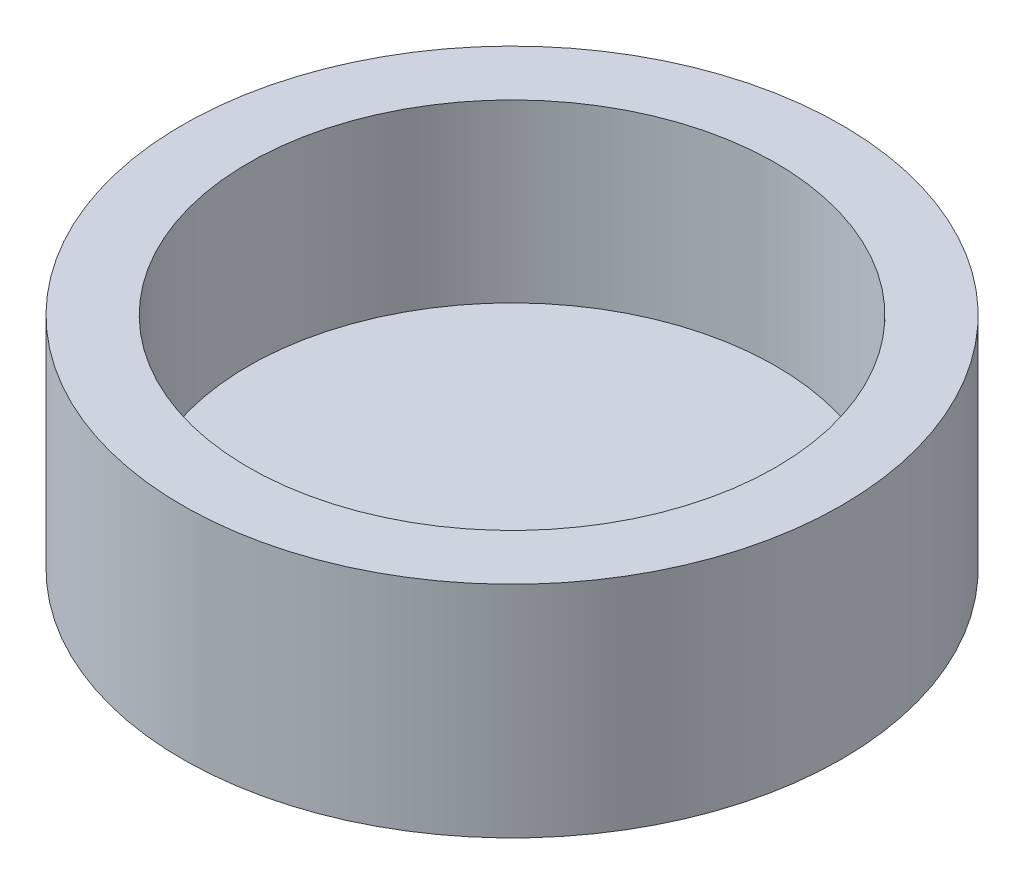
ISO-10303-21;
HEADER;
FILE_DESCRIPTION(('STEP AP214'),'2;1');
FILE_NAME('part.step','',(''),(''),'','','');
FILE_SCHEMA(('AUTOMOTIVE_DESIGN { 1 0 10303 214 1 1 1 1 }'));
ENDSEC;
DATA;
#1=APPLICATION_CONTEXT('core data for automotive mechanical design processes');
#2=APPLICATION_PROTOCOL_DEFINITION('international standard','automotive_design',2000,#1);
#3=PRODUCT_CONTEXT('',#1,'mechanical');
#4=PRODUCT('Part','Part','',(#3));
#5=PRODUCT_RELATED_PRODUCT_CATEGORY('part','',(#4));
#6=PRODUCT_DEFINITION_FORMATION('','',#4);
#7=PRODUCT_DEFINITION_CONTEXT('part definition',#1,'design');
#8=PRODUCT_DEFINITION('design','',#6,#7);
#9=PRODUCT_DEFINITION_SHAPE('','',#8);
#10=(LENGTH_UNIT() NAMED_UNIT(*) SI_UNIT(.MILLI.,.METRE.));
#11=(NAMED_UNIT(*) PLANE_ANGLE_UNIT() SI_UNIT($,.RADIAN.));
#12=(NAMED_UNIT(*) SI_UNIT($,.STERADIAN.) SOLID_ANGLE_UNIT());
#13=UNCERTAINTY_MEASURE_WITH_UNIT(LENGTH_MEASURE(1.E-05),#10,'distance_accuracy_value','');
#14=(GEOMETRIC_REPRESENTATION_CONTEXT(3) GLOBAL_UNCERTAINTY_ASSIGNED_CONTEXT((#13)) GLOBAL_UNIT_ASSIGNED_CONTEXT((#10,
#11,#12)) REPRESENTATION_CONTEXT('',''));
#15=CARTESIAN_POINT('',(0.,0.,0.));
#16=DIRECTION('',(0.,0.,1.));
#17=DIRECTION('',(1.,0.,0.));
#18=AXIS2_PLACEMENT_3D('',#15,#16,#17);
#19=CARTESIAN_POINT('',(0.,0.,0.));
#20=DIRECTION('',(0.,1.,0.));
#21=DIRECTION('',(-1.,0.,0.));
#22=AXIS2_PLACEMENT_3D('',#19,#20,#21);
#23=PLANE('',#22);
#24=CARTESIAN_POINT('',(0.,0.,0.));
#25=DIRECTION('',(0.,-1.,0.));
#26=DIRECTION('',(1.,0.,0.));
#27=AXIS2_PLACEMENT_3D('',#24,#25,#26);
#28=CIRCLE('',#27,6.);
#29=CARTESIAN_POINT('',(6.,0.,0.));
#30=VERTEX_POINT('',#29);
#31=EDGE_CURVE('E10',#30,#30,#28,.T.);
#32=ORIENTED_EDGE('',*,*,#31,.F.);
#33=EDGE_LOOP('',(#32));
#34=FACE_BOUND('',#33,.T.);
#35=ADVANCED_FACE('F42',(#34),#23,.T.);
#36=CARTESIAN_POINT('',(3.4200822914393E-13,-99.7036160509116,0.));
#37=DIRECTION('',(0.,-1.,0.));
#38=DIRECTION('',(1.,0.,0.));
#39=AXIS2_PLACEMENT_3D('',#36,#37,#38);
#40=CYLINDRICAL_SURFACE('',#39,6.00000000000001);
#41=ORIENTED_EDGE('',*,*,#31,.T.);
#42=EDGE_LOOP('',(#41));
#43=FACE_BOUND('',#42,.T.);
#44=CARTESIAN_POINT('',(0.,3.99999999999999,0.));
#45=DIRECTION('',(0.,-1.,0.));
#46=DIRECTION('',(1.,0.,0.));
#47=AXIS2_PLACEMENT_3D('',#44,#45,#46);
#48=CIRCLE('',#47,6.00000000000001);
#49=CARTESIAN_POINT('',(6.,4.00000000000001,0.));
#50=VERTEX_POINT('',#49);
#51=EDGE_CURVE('E49',#50,#50,#48,.T.);
#52=ORIENTED_EDGE('',*,*,#51,.F.);
#53=EDGE_LOOP('',(#52));
#54=FACE_BOUND('',#53,.T.);
#55=ADVANCED_FACE('F78',(#43,#54),#40,.F.);
#56=CARTESIAN_POINT('',(6.,4.,0.));
#57=DIRECTION('',(0.,1.,0.));
#58=DIRECTION('',(-1.,0.,0.));
#59=AXIS2_PLACEMENT_3D('',#56,#57,#58);
#60=PLANE('',#59);
#61=ORIENTED_EDGE('',*,*,#51,.T.);
#62=EDGE_LOOP('',(#61));
#63=FACE_BOUND('',#62,.T.);
#64=CARTESIAN_POINT('',(0.,3.99999999999998,0.));
#65=DIRECTION('',(0.,-1.,0.));
#66=DIRECTION('',(1.,0.,0.));
#67=AXIS2_PLACEMENT_3D('',#64,#65,#66);
#68=CIRCLE('',#67,7.50000000000001);
#69=CARTESIAN_POINT('',(7.5,4.,0.));
#70=VERTEX_POINT('',#69);
#71=EDGE_CURVE('E54',#70,#70,#68,.T.);
#72=ORIENTED_EDGE('',*,*,#71,.F.);
#73=EDGE_LOOP('',(#72));
#74=FACE_BOUND('',#73,.T.);
#75=ADVANCED_FACE('F70',(#63,#74),#60,.T.);
#76=CARTESIAN_POINT('',(3.4200822914393E-13,-99.7036160509116,0.));
#77=DIRECTION('',(0.,-1.,0.));
#78=DIRECTION('',(1.,0.,0.));
#79=AXIS2_PLACEMENT_3D('',#76,#77,#78);
#80=CYLINDRICAL_SURFACE('',#79,7.50000000000001);
#81=ORIENTED_EDGE('',*,*,#71,.T.);
#82=EDGE_LOOP('',(#81));
#83=FACE_BOUND('',#82,.T.);
#84=CARTESIAN_POINT('',(0.,-1.00000000000003,0.));
#85=DIRECTION('',(0.,-1.,0.));
#86=DIRECTION('',(1.,0.,0.));
#87=AXIS2_PLACEMENT_3D('',#84,#85,#86);
#88=CIRCLE('',#87,7.5);
#89=CARTESIAN_POINT('',(7.5,-1.,0.));
#90=VERTEX_POINT('',#89);
#91=EDGE_CURVE('E59',#90,#90,#88,.T.);
#92=ORIENTED_EDGE('',*,*,#91,.F.);
#93=EDGE_LOOP('',(#92));
#94=FACE_BOUND('',#93,.T.);
#95=ADVANCED_FACE('F68',(#83,#94),#80,.T.);
#96=CARTESIAN_POINT('',(7.5,-0.999999999999991,0.));
#97=DIRECTION('',(0.,-1.,0.));
#98=DIRECTION('',(1.,0.,0.));
#99=AXIS2_PLACEMENT_3D('',#96,#97,#98);
#100=PLANE('',#99);
#101=ORIENTED_EDGE('',*,*,#91,.T.);
#102=EDGE_LOOP('',(#101));
#103=FACE_BOUND('',#102,.T.);
#104=ADVANCED_FACE('F66',(#103),#100,.T.);
#105=CLOSED_SHELL('',(#35,#55,#75,#95,#104));
#106=MANIFOLD_SOLID_BREP('B2',#105);
#107=ADVANCED_BREP_SHAPE_REPRESENTATION('',(#18,#106),#14);
#108=SHAPE_DEFINITION_REPRESENTATION(#9,#107);
ENDSEC;
END-ISO-10303-21;
